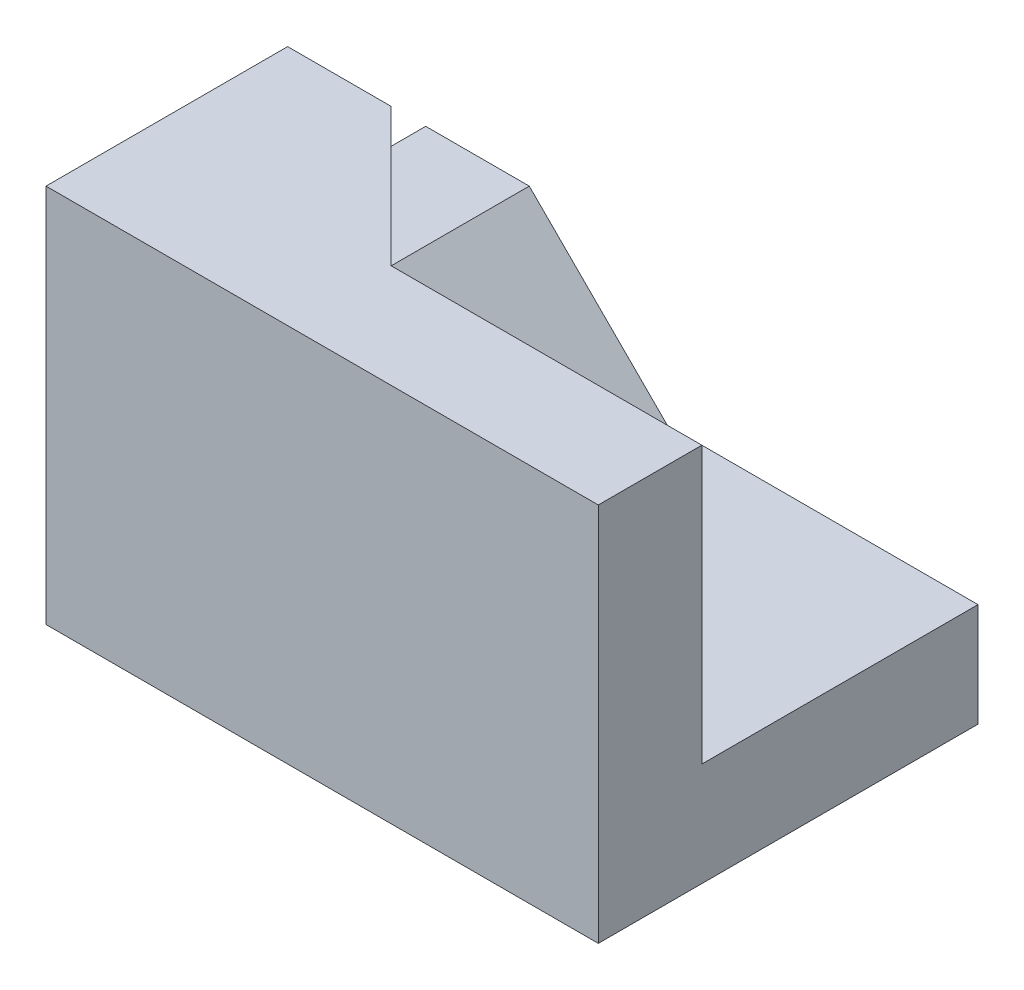
ISO-10303-21;
HEADER;
FILE_DESCRIPTION(('STEP AP214'),'2;1');
FILE_NAME('part.step','',(''),(''),'','','');
FILE_SCHEMA(('AUTOMOTIVE_DESIGN { 1 0 10303 214 1 1 1 1 }'));
ENDSEC;
DATA;
#1=APPLICATION_CONTEXT('core data for automotive mechanical design processes');
#2=APPLICATION_PROTOCOL_DEFINITION('international standard','automotive_design',2000,#1);
#3=PRODUCT_CONTEXT('',#1,'mechanical');
#4=PRODUCT('Part','Part','',(#3));
#5=PRODUCT_RELATED_PRODUCT_CATEGORY('part','',(#4));
#6=PRODUCT_DEFINITION_FORMATION('','',#4);
#7=PRODUCT_DEFINITION_CONTEXT('part definition',#1,'design');
#8=PRODUCT_DEFINITION('design','',#6,#7);
#9=PRODUCT_DEFINITION_SHAPE('','',#8);
#10=(LENGTH_UNIT() NAMED_UNIT(*) SI_UNIT(.MILLI.,.METRE.));
#11=(NAMED_UNIT(*) PLANE_ANGLE_UNIT() SI_UNIT($,.RADIAN.));
#12=(NAMED_UNIT(*) SI_UNIT($,.STERADIAN.) SOLID_ANGLE_UNIT());
#13=UNCERTAINTY_MEASURE_WITH_UNIT(LENGTH_MEASURE(1.E-05),#10,'distance_accuracy_value','');
#14=(GEOMETRIC_REPRESENTATION_CONTEXT(3) GLOBAL_UNCERTAINTY_ASSIGNED_CONTEXT((#13)) GLOBAL_UNIT_ASSIGNED_CONTEXT((#10,
#11,#12)) REPRESENTATION_CONTEXT('',''));
#15=CARTESIAN_POINT('',(0.,0.,0.));
#16=DIRECTION('',(0.,0.,1.));
#17=DIRECTION('',(1.,0.,0.));
#18=AXIS2_PLACEMENT_3D('',#15,#16,#17);
#19=CARTESIAN_POINT('',(0.,55.,-55.));
#20=DIRECTION('',(0.,0.,-1.));
#21=DIRECTION('',(-1.,0.,0.));
#22=AXIS2_PLACEMENT_3D('',#19,#20,#21);
#23=PLANE('',#22);
#24=DIRECTION('',(-1.,0.,0.));
#25=VECTOR('',#24,1.);
#26=CARTESIAN_POINT('',(15.,35.,-55.));
#27=LINE('',#26,#25);
#28=CARTESIAN_POINT('',(15.,35.,-55.));
#29=VERTEX_POINT('',#28);
#30=CARTESIAN_POINT('',(0.,35.,-55.));
#31=VERTEX_POINT('',#30);
#32=EDGE_CURVE('E134',#29,#31,#27,.T.);
#33=ORIENTED_EDGE('',*,*,#32,.F.);
#34=DIRECTION('',(-0.707106781186548,0.707106781186547,0.));
#35=VECTOR('',#34,1.);
#36=CARTESIAN_POINT('',(35.,15.,-55.));
#37=LINE('',#36,#35);
#38=CARTESIAN_POINT('',(35.,15.,-55.));
#39=VERTEX_POINT('',#38);
#40=EDGE_CURVE('E407',#39,#29,#37,.T.);
#41=ORIENTED_EDGE('',*,*,#40,.F.);
#42=DIRECTION('',(1.,0.,0.));
#43=VECTOR('',#42,1.);
#44=CARTESIAN_POINT('',(35.,15.,-55.));
#45=LINE('',#44,#43);
#46=CARTESIAN_POINT('',(80.,15.,-55.));
#47=VERTEX_POINT('',#46);
#48=EDGE_CURVE('E110',#39,#47,#45,.T.);
#49=ORIENTED_EDGE('',*,*,#48,.T.);
#50=DIRECTION('',(0.,-1.,0.));
#51=VECTOR('',#50,1.);
#52=CARTESIAN_POINT('',(80.,55.,-55.));
#53=LINE('',#52,#51);
#54=CARTESIAN_POINT('',(80.,0.,-55.));
#55=VERTEX_POINT('',#54);
#56=EDGE_CURVE('E104',#47,#55,#53,.T.);
#57=ORIENTED_EDGE('',*,*,#56,.T.);
#58=DIRECTION('',(1.,0.,0.));
#59=VECTOR('',#58,1.);
#60=CARTESIAN_POINT('',(0.,0.,-55.));
#61=LINE('',#60,#59);
#62=CARTESIAN_POINT('',(0.,0.,-55.));
#63=VERTEX_POINT('',#62);
#64=EDGE_CURVE('E101',#63,#55,#61,.T.);
#65=ORIENTED_EDGE('',*,*,#64,.F.);
#66=DIRECTION('',(0.,-1.,0.));
#67=VECTOR('',#66,1.);
#68=CARTESIAN_POINT('',(0.,55.,-55.));
#69=LINE('',#68,#67);
#70=EDGE_CURVE('E12',#31,#63,#69,.T.);
#71=ORIENTED_EDGE('',*,*,#70,.F.);
#72=EDGE_LOOP('',(#33,#41,#49,#57,#65,#71));
#73=FACE_BOUND('',#72,.T.);
#74=ADVANCED_FACE('F55',(#73),#23,.T.);
#75=CARTESIAN_POINT('',(0.,55.,0.));
#76=DIRECTION('',(0.,1.,0.));
#77=DIRECTION('',(0.,0.,1.));
#78=AXIS2_PLACEMENT_3D('',#75,#76,#77);
#79=PLANE('',#78);
#80=DIRECTION('',(1.,0.,0.));
#81=VECTOR('',#80,1.);
#82=CARTESIAN_POINT('',(35.,55.,-15.));
#83=LINE('',#82,#81);
#84=CARTESIAN_POINT('',(35.,55.,-15.));
#85=VERTEX_POINT('',#84);
#86=CARTESIAN_POINT('',(80.,55.,-15.));
#87=VERTEX_POINT('',#86);
#88=EDGE_CURVE('E193',#85,#87,#83,.T.);
#89=ORIENTED_EDGE('',*,*,#88,.F.);
#90=DIRECTION('',(-0.707106781186547,0.,-0.707106781186548));
#91=VECTOR('',#90,1.);
#92=CARTESIAN_POINT('',(35.,55.,-15.));
#93=LINE('',#92,#91);
#94=CARTESIAN_POINT('',(15.,55.,-35.));
#95=VERTEX_POINT('',#94);
#96=EDGE_CURVE('E295',#85,#95,#93,.T.);
#97=ORIENTED_EDGE('',*,*,#96,.T.);
#98=DIRECTION('',(-1.,0.,0.));
#99=VECTOR('',#98,1.);
#100=CARTESIAN_POINT('',(15.,55.,-35.));
#101=LINE('',#100,#99);
#102=CARTESIAN_POINT('',(0.,55.,-35.));
#103=VERTEX_POINT('',#102);
#104=EDGE_CURVE('E224',#95,#103,#101,.T.);
#105=ORIENTED_EDGE('',*,*,#104,.T.);
#106=DIRECTION('',(0.,0.,-1.));
#107=VECTOR('',#106,1.);
#108=CARTESIAN_POINT('',(0.,55.,0.));
#109=LINE('',#108,#107);
#110=CARTESIAN_POINT('',(0.,55.,0.));
#111=VERTEX_POINT('',#110);
#112=EDGE_CURVE('E133',#111,#103,#109,.T.);
#113=ORIENTED_EDGE('',*,*,#112,.F.);
#114=DIRECTION('',(1.,0.,0.));
#115=VECTOR('',#114,1.);
#116=CARTESIAN_POINT('',(0.,55.,0.));
#117=LINE('',#116,#115);
#118=CARTESIAN_POINT('',(80.,55.,0.));
#119=VERTEX_POINT('',#118);
#120=EDGE_CURVE('E120',#111,#119,#117,.T.);
#121=ORIENTED_EDGE('',*,*,#120,.T.);
#122=DIRECTION('',(0.,0.,-1.));
#123=VECTOR('',#122,1.);
#124=CARTESIAN_POINT('',(80.,55.,0.));
#125=LINE('',#124,#123);
#126=EDGE_CURVE('E115',#119,#87,#125,.T.);
#127=ORIENTED_EDGE('',*,*,#126,.T.);
#128=EDGE_LOOP('',(#89,#97,#105,#113,#121,#127));
#129=FACE_BOUND('',#128,.T.);
#130=ADVANCED_FACE('F286',(#129),#79,.T.);
#131=CARTESIAN_POINT('',(0.,55.,0.));
#132=DIRECTION('',(-1.,0.,0.));
#133=DIRECTION('',(0.,0.,1.));
#134=AXIS2_PLACEMENT_3D('',#131,#132,#133);
#135=PLANE('',#134);
#136=DIRECTION('',(0.,1.,0.));
#137=VECTOR('',#136,1.);
#138=CARTESIAN_POINT('',(0.,55.,-35.));
#139=LINE('',#138,#137);
#140=CARTESIAN_POINT('',(0.,35.,-35.));
#141=VERTEX_POINT('',#140);
#142=EDGE_CURVE('E255',#141,#103,#139,.T.);
#143=ORIENTED_EDGE('',*,*,#142,.F.);
#144=DIRECTION('',(0.,0.,1.));
#145=VECTOR('',#144,1.);
#146=CARTESIAN_POINT('',(0.,35.,-55.));
#147=LINE('',#146,#145);
#148=EDGE_CURVE('E97',#31,#141,#147,.T.);
#149=ORIENTED_EDGE('',*,*,#148,.F.);
#150=ORIENTED_EDGE('',*,*,#70,.T.);
#151=DIRECTION('',(0.,0.,-1.));
#152=VECTOR('',#151,1.);
#153=CARTESIAN_POINT('',(0.,0.,0.));
#154=LINE('',#153,#152);
#155=CARTESIAN_POINT('',(0.,0.,0.));
#156=VERTEX_POINT('',#155);
#157=EDGE_CURVE('E94',#156,#63,#154,.T.);
#158=ORIENTED_EDGE('',*,*,#157,.F.);
#159=DIRECTION('',(0.,-1.,0.));
#160=VECTOR('',#159,1.);
#161=CARTESIAN_POINT('',(0.,55.,0.));
#162=LINE('',#161,#160);
#163=EDGE_CURVE('E65',#111,#156,#162,.T.);
#164=ORIENTED_EDGE('',*,*,#163,.F.);
#165=ORIENTED_EDGE('',*,*,#112,.T.);
#166=EDGE_LOOP('',(#143,#149,#150,#158,#164,#165));
#167=FACE_BOUND('',#166,.T.);
#168=ADVANCED_FACE('F92',(#167),#135,.T.);
#169=CARTESIAN_POINT('',(0.,55.,0.));
#170=DIRECTION('',(0.,0.,-1.));
#171=DIRECTION('',(-1.,0.,0.));
#172=AXIS2_PLACEMENT_3D('',#169,#170,#171);
#173=PLANE('',#172);
#174=DIRECTION('',(1.,0.,0.));
#175=VECTOR('',#174,1.);
#176=CARTESIAN_POINT('',(0.,0.,0.));
#177=LINE('',#176,#175);
#178=CARTESIAN_POINT('',(80.,0.,0.));
#179=VERTEX_POINT('',#178);
#180=EDGE_CURVE('E113',#156,#179,#177,.T.);
#181=ORIENTED_EDGE('',*,*,#180,.T.);
#182=DIRECTION('',(0.,-1.,0.));
#183=VECTOR('',#182,1.);
#184=CARTESIAN_POINT('',(80.,55.,0.));
#185=LINE('',#184,#183);
#186=EDGE_CURVE('E127',#119,#179,#185,.T.);
#187=ORIENTED_EDGE('',*,*,#186,.F.);
#188=ORIENTED_EDGE('',*,*,#120,.F.);
#189=ORIENTED_EDGE('',*,*,#163,.T.);
#190=EDGE_LOOP('',(#181,#187,#188,#189));
#191=FACE_BOUND('',#190,.T.);
#192=ADVANCED_FACE('F283',(#191),#173,.F.);
#193=CARTESIAN_POINT('',(80.,55.,0.));
#194=DIRECTION('',(-1.,0.,0.));
#195=DIRECTION('',(0.,0.,1.));
#196=AXIS2_PLACEMENT_3D('',#193,#194,#195);
#197=PLANE('',#196);
#198=ORIENTED_EDGE('',*,*,#56,.F.);
#199=DIRECTION('',(0.,0.,-1.));
#200=VECTOR('',#199,1.);
#201=CARTESIAN_POINT('',(80.,15.,-55.));
#202=LINE('',#201,#200);
#203=CARTESIAN_POINT('',(80.,15.,-15.));
#204=VERTEX_POINT('',#203);
#205=EDGE_CURVE('E270',#204,#47,#202,.T.);
#206=ORIENTED_EDGE('',*,*,#205,.F.);
#207=DIRECTION('',(0.,-1.,0.));
#208=VECTOR('',#207,1.);
#209=CARTESIAN_POINT('',(80.,55.,-15.));
#210=LINE('',#209,#208);
#211=EDGE_CURVE('E228',#87,#204,#210,.T.);
#212=ORIENTED_EDGE('',*,*,#211,.F.);
#213=ORIENTED_EDGE('',*,*,#126,.F.);
#214=ORIENTED_EDGE('',*,*,#186,.T.);
#215=DIRECTION('',(0.,0.,-1.));
#216=VECTOR('',#215,1.);
#217=CARTESIAN_POINT('',(80.,0.,0.));
#218=LINE('',#217,#216);
#219=EDGE_CURVE('E109',#179,#55,#218,.T.);
#220=ORIENTED_EDGE('',*,*,#219,.T.);
#221=EDGE_LOOP('',(#198,#206,#212,#213,#214,#220));
#222=FACE_BOUND('',#221,.T.);
#223=ADVANCED_FACE('F278',(#222),#197,.F.);
#224=CARTESIAN_POINT('',(0.,0.,0.));
#225=DIRECTION('',(0.,1.,0.));
#226=DIRECTION('',(0.,0.,1.));
#227=AXIS2_PLACEMENT_3D('',#224,#225,#226);
#228=PLANE('',#227);
#229=ORIENTED_EDGE('',*,*,#64,.T.);
#230=ORIENTED_EDGE('',*,*,#219,.F.);
#231=ORIENTED_EDGE('',*,*,#180,.F.);
#232=ORIENTED_EDGE('',*,*,#157,.T.);
#233=EDGE_LOOP('',(#229,#230,#231,#232));
#234=FACE_BOUND('',#233,.T.);
#235=ADVANCED_FACE('F112',(#234),#228,.F.);
#236=CARTESIAN_POINT('',(35.,15.,-55.));
#237=DIRECTION('',(0.,-1.,0.));
#238=DIRECTION('',(0.,0.,-1.));
#239=AXIS2_PLACEMENT_3D('',#236,#237,#238);
#240=PLANE('',#239);
#241=ORIENTED_EDGE('',*,*,#205,.T.);
#242=ORIENTED_EDGE('',*,*,#48,.F.);
#243=CARTESIAN_POINT('',(35.,15.,-15.));
#244=DIRECTION('',(0.,0.,-1.));
#245=VECTOR('',#244,1.);
#246=LINE('',#243,#245);
#247=CARTESIAN_POINT('',(35.,15.,-15.));
#248=VERTEX_POINT('',#247);
#249=EDGE_CURVE('E201',#248,#39,#246,.T.);
#250=ORIENTED_EDGE('',*,*,#249,.F.);
#251=DIRECTION('',(1.,0.,0.));
#252=VECTOR('',#251,1.);
#253=CARTESIAN_POINT('',(35.,15.,-15.));
#254=LINE('',#253,#252);
#255=EDGE_CURVE('E188',#248,#204,#254,.T.);
#256=ORIENTED_EDGE('',*,*,#255,.T.);
#257=EDGE_LOOP('',(#241,#242,#250,#256));
#258=FACE_BOUND('',#257,.T.);
#259=ADVANCED_FACE('F168',(#258),#240,.F.);
#260=CARTESIAN_POINT('',(35.,55.,-15.));
#261=DIRECTION('',(0.,0.,1.));
#262=DIRECTION('',(0.,-1.,0.));
#263=AXIS2_PLACEMENT_3D('',#260,#261,#262);
#264=PLANE('',#263);
#265=ORIENTED_EDGE('',*,*,#211,.T.);
#266=ORIENTED_EDGE('',*,*,#255,.F.);
#267=CARTESIAN_POINT('',(35.,55.,-15.));
#268=DIRECTION('',(0.,-1.,0.));
#269=VECTOR('',#268,1.);
#270=LINE('',#267,#269);
#271=EDGE_CURVE('E218',#85,#248,#270,.T.);
#272=ORIENTED_EDGE('',*,*,#271,.F.);
#273=ORIENTED_EDGE('',*,*,#88,.T.);
#274=EDGE_LOOP('',(#265,#266,#272,#273));
#275=FACE_BOUND('',#274,.T.);
#276=ADVANCED_FACE('F172',(#275),#264,.F.);
#277=CARTESIAN_POINT('',(15.,55.,-35.));
#278=DIRECTION('',(0.,0.,1.));
#279=DIRECTION('',(1.,0.,0.));
#280=AXIS2_PLACEMENT_3D('',#277,#278,#279);
#281=PLANE('',#280);
#282=ORIENTED_EDGE('',*,*,#142,.T.);
#283=ORIENTED_EDGE('',*,*,#104,.F.);
#284=CARTESIAN_POINT('',(15.,35.,-35.));
#285=DIRECTION('',(0.,1.,0.));
#286=VECTOR('',#285,1.);
#287=LINE('',#284,#286);
#288=CARTESIAN_POINT('',(15.,35.,-35.));
#289=VERTEX_POINT('',#288);
#290=EDGE_CURVE('E139',#289,#95,#287,.T.);
#291=ORIENTED_EDGE('',*,*,#290,.F.);
#292=DIRECTION('',(-1.,0.,0.));
#293=VECTOR('',#292,1.);
#294=CARTESIAN_POINT('',(15.,35.,-35.));
#295=LINE('',#294,#293);
#296=EDGE_CURVE('E138',#289,#141,#295,.T.);
#297=ORIENTED_EDGE('',*,*,#296,.T.);
#298=EDGE_LOOP('',(#282,#283,#291,#297));
#299=FACE_BOUND('',#298,.T.);
#300=ADVANCED_FACE('F165',(#299),#281,.F.);
#301=CARTESIAN_POINT('',(15.,35.,-55.));
#302=DIRECTION('',(0.,-1.,0.));
#303=DIRECTION('',(0.,0.,-1.));
#304=AXIS2_PLACEMENT_3D('',#301,#302,#303);
#305=PLANE('',#304);
#306=ORIENTED_EDGE('',*,*,#148,.T.);
#307=ORIENTED_EDGE('',*,*,#296,.F.);
#308=CARTESIAN_POINT('',(15.,35.,-55.));
#309=DIRECTION('',(0.,0.,1.));
#310=VECTOR('',#309,1.);
#311=LINE('',#308,#310);
#312=EDGE_CURVE('E148',#29,#289,#311,.T.);
#313=ORIENTED_EDGE('',*,*,#312,.F.);
#314=ORIENTED_EDGE('',*,*,#32,.T.);
#315=EDGE_LOOP('',(#306,#307,#313,#314));
#316=FACE_BOUND('',#315,.T.);
#317=ADVANCED_FACE('F154',(#316),#305,.F.);
#318=CARTESIAN_POINT('',(25.,0.,-25.));
#319=DIRECTION('',(0.707106781186548,0.,-0.707106781186547));
#320=DIRECTION('',(-0.707106781186547,0.,-0.707106781186548));
#321=AXIS2_PLACEMENT_3D('',#318,#319,#320);
#322=PLANE('',#321);
#323=ORIENTED_EDGE('',*,*,#96,.F.);
#324=ORIENTED_EDGE('',*,*,#271,.T.);
#325=DIRECTION('',(-0.577350269189626,0.577350269189626,-0.577350269189626));
#326=VECTOR('',#325,1.);
#327=CARTESIAN_POINT('',(35.,15.,-15.));
#328=LINE('',#327,#326);
#329=EDGE_CURVE('E264',#248,#289,#328,.T.);
#330=ORIENTED_EDGE('',*,*,#329,.T.);
#331=ORIENTED_EDGE('',*,*,#290,.T.);
#332=EDGE_LOOP('',(#323,#324,#330,#331));
#333=FACE_BOUND('',#332,.T.);
#334=ADVANCED_FACE('F164',(#333),#322,.T.);
#335=CARTESIAN_POINT('',(25.,25.,0.));
#336=DIRECTION('',(0.707106781186547,0.707106781186548,0.));
#337=DIRECTION('',(-0.707106781186548,0.707106781186547,0.));
#338=AXIS2_PLACEMENT_3D('',#335,#336,#337);
#339=PLANE('',#338);
#340=ORIENTED_EDGE('',*,*,#329,.F.);
#341=ORIENTED_EDGE('',*,*,#249,.T.);
#342=ORIENTED_EDGE('',*,*,#40,.T.);
#343=ORIENTED_EDGE('',*,*,#312,.T.);
#344=EDGE_LOOP('',(#340,#341,#342,#343));
#345=FACE_BOUND('',#344,.T.);
#346=ADVANCED_FACE('F369',(#345),#339,.T.);
#347=CLOSED_SHELL('',(#74,#130,#168,#192,#223,#235,#259,#276,#300,#317,#334,#346));
#348=MANIFOLD_SOLID_BREP('B2',#347);
#349=ADVANCED_BREP_SHAPE_REPRESENTATION('',(#18,#348),#14);
#350=SHAPE_DEFINITION_REPRESENTATION(#9,#349);
ENDSEC;
END-ISO-10303-21;
